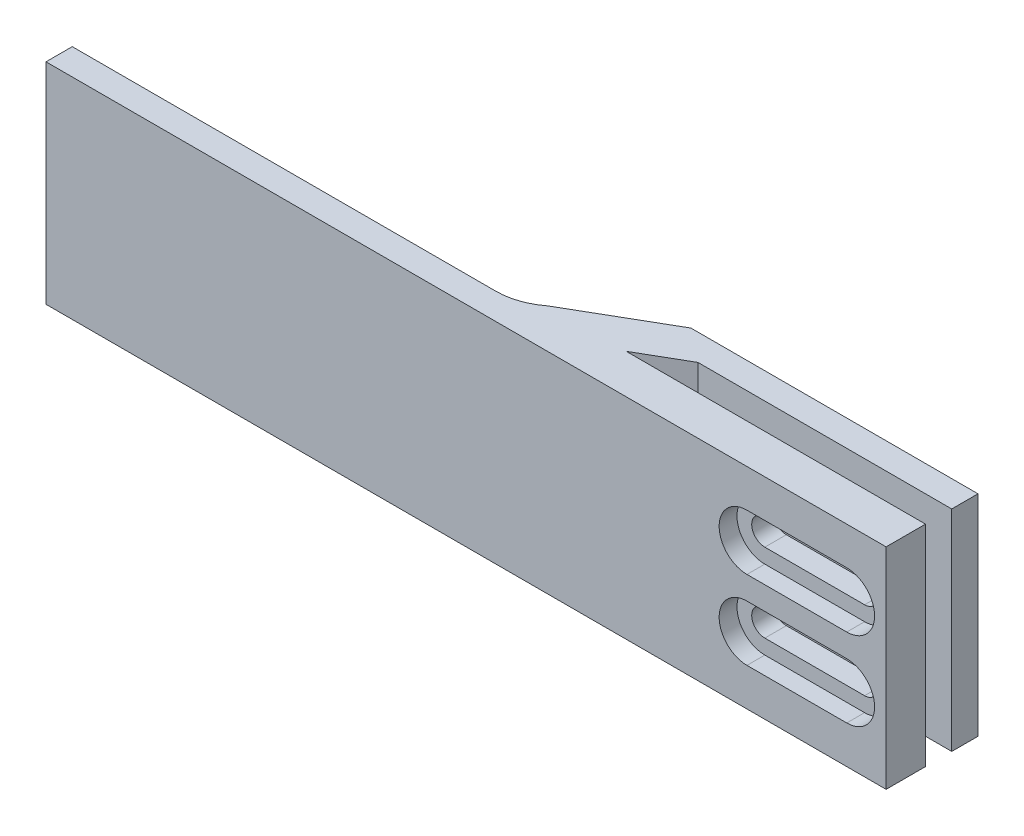
ISO-10303-21;
HEADER;
FILE_DESCRIPTION(('STEP AP214'),'2;1');
FILE_NAME('part.step','',(''),(''),'','','');
FILE_SCHEMA(('AUTOMOTIVE_DESIGN { 1 0 10303 214 1 1 1 1 }'));
ENDSEC;
DATA;
#1=APPLICATION_CONTEXT('core data for automotive mechanical design processes');
#2=APPLICATION_PROTOCOL_DEFINITION('international standard','automotive_design',2000,#1);
#3=PRODUCT_CONTEXT('',#1,'mechanical');
#4=PRODUCT('Part','Part','',(#3));
#5=PRODUCT_RELATED_PRODUCT_CATEGORY('part','',(#4));
#6=PRODUCT_DEFINITION_FORMATION('','',#4);
#7=PRODUCT_DEFINITION_CONTEXT('part definition',#1,'design');
#8=PRODUCT_DEFINITION('design','',#6,#7);
#9=PRODUCT_DEFINITION_SHAPE('','',#8);
#10=(LENGTH_UNIT() NAMED_UNIT(*) SI_UNIT(.MILLI.,.METRE.));
#11=(NAMED_UNIT(*) PLANE_ANGLE_UNIT() SI_UNIT($,.RADIAN.));
#12=(NAMED_UNIT(*) SI_UNIT($,.STERADIAN.) SOLID_ANGLE_UNIT());
#13=UNCERTAINTY_MEASURE_WITH_UNIT(LENGTH_MEASURE(1.E-05),#10,'distance_accuracy_value','');
#14=(GEOMETRIC_REPRESENTATION_CONTEXT(3) GLOBAL_UNCERTAINTY_ASSIGNED_CONTEXT((#13)) GLOBAL_UNIT_ASSIGNED_CONTEXT((#10,
#11,#12)) REPRESENTATION_CONTEXT('',''));
#15=CARTESIAN_POINT('',(0.,0.,0.));
#16=DIRECTION('',(0.,0.,1.));
#17=DIRECTION('',(1.,0.,0.));
#18=AXIS2_PLACEMENT_3D('',#15,#16,#17);
#19=CARTESIAN_POINT('',(0.,19.05,-15.5672163536067));
#20=DIRECTION('',(0.,1.,0.));
#21=DIRECTION('',(0.,0.,1.));
#22=AXIS2_PLACEMENT_3D('',#19,#20,#21);
#23=PLANE('',#22);
#24=DIRECTION('',(1.,0.,0.));
#25=VECTOR('',#24,1.);
#26=CARTESIAN_POINT('',(0.,19.05,8.95350000000002));
#27=LINE('',#26,#25);
#28=CARTESIAN_POINT('',(-16.8275,19.05,8.95350000000002));
#29=VERTEX_POINT('',#28);
#30=CARTESIAN_POINT('',(-4.7625,19.05,8.95350000000002));
#31=VERTEX_POINT('',#30);
#32=EDGE_CURVE('E301',#29,#31,#27,.T.);
#33=ORIENTED_EDGE('',*,*,#32,.F.);
#34=DIRECTION('',(0.,0.,1.));
#35=VECTOR('',#34,1.);
#36=CARTESIAN_POINT('',(-16.8275,19.05,-15.5672163536067));
#37=LINE('',#36,#35);
#38=CARTESIAN_POINT('',(-16.8275,19.05,6.35000000000001));
#39=VERTEX_POINT('',#38);
#40=EDGE_CURVE('E386',#39,#29,#37,.T.);
#41=ORIENTED_EDGE('',*,*,#40,.F.);
#42=DIRECTION('',(1.,0.,0.));
#43=VECTOR('',#42,1.);
#44=CARTESIAN_POINT('',(0.,19.05,6.35000000000002));
#45=LINE('',#44,#43);
#46=CARTESIAN_POINT('',(-4.7625,19.05,6.35000000000002));
#47=VERTEX_POINT('',#46);
#48=EDGE_CURVE('E498',#39,#47,#45,.T.);
#49=ORIENTED_EDGE('',*,*,#48,.T.);
#50=DIRECTION('',(0.,0.,1.));
#51=VECTOR('',#50,1.);
#52=CARTESIAN_POINT('',(-4.7625,19.05,-15.5672163536067));
#53=LINE('',#52,#51);
#54=EDGE_CURVE('E391',#47,#31,#53,.T.);
#55=ORIENTED_EDGE('',*,*,#54,.T.);
#56=EDGE_LOOP('',(#33,#41,#49,#55));
#57=FACE_BOUND('',#56,.T.);
#58=ADVANCED_FACE('F34',(#57),#23,.F.);
#59=CARTESIAN_POINT('',(-4.7625,17.4625,-15.5672163536067));
#60=DIRECTION('',(0.,0.,1.));
#61=DIRECTION('',(1.,0.,0.));
#62=AXIS2_PLACEMENT_3D('',#59,#60,#61);
#63=CYLINDRICAL_SURFACE('',#62,1.5875);
#64=CARTESIAN_POINT('',(-4.7625,17.4625,8.95350000000002));
#65=DIRECTION('',(0.,0.,1.));
#66=DIRECTION('',(1.,0.,0.));
#67=AXIS2_PLACEMENT_3D('',#64,#65,#66);
#68=CIRCLE('',#67,1.5875);
#69=CARTESIAN_POINT('',(-4.7625,15.875,8.95350000000002));
#70=VERTEX_POINT('',#69);
#71=EDGE_CURVE('E299',#31,#70,#68,.F.);
#72=ORIENTED_EDGE('',*,*,#71,.F.);
#73=ORIENTED_EDGE('',*,*,#54,.F.);
#74=CARTESIAN_POINT('',(-4.7625,17.4625,6.35000000000002));
#75=DIRECTION('',(0.,0.,-1.));
#76=DIRECTION('',(-1.,0.,0.));
#77=AXIS2_PLACEMENT_3D('',#74,#75,#76);
#78=CIRCLE('',#77,1.5875);
#79=CARTESIAN_POINT('',(-4.7625,15.875,6.35000000000002));
#80=VERTEX_POINT('',#79);
#81=EDGE_CURVE('E500',#47,#80,#78,.T.);
#82=ORIENTED_EDGE('',*,*,#81,.T.);
#83=DIRECTION('',(0.,0.,1.));
#84=VECTOR('',#83,1.);
#85=CARTESIAN_POINT('',(-4.7625,15.875,-15.5672163536067));
#86=LINE('',#85,#84);
#87=EDGE_CURVE('E397',#80,#70,#86,.T.);
#88=ORIENTED_EDGE('',*,*,#87,.T.);
#89=EDGE_LOOP('',(#72,#73,#82,#88));
#90=FACE_BOUND('',#89,.T.);
#91=ADVANCED_FACE('F557',(#90),#63,.F.);
#92=CARTESIAN_POINT('',(0.,15.875,-15.5672163536067));
#93=DIRECTION('',(0.,1.,0.));
#94=DIRECTION('',(0.,0.,1.));
#95=AXIS2_PLACEMENT_3D('',#92,#93,#94);
#96=PLANE('',#95);
#97=DIRECTION('',(0.,0.,1.));
#98=VECTOR('',#97,1.);
#99=CARTESIAN_POINT('',(-16.8275,15.875,-15.5672163536067));
#100=LINE('',#99,#98);
#101=CARTESIAN_POINT('',(-16.8275,15.875,6.35000000000002));
#102=VERTEX_POINT('',#101);
#103=CARTESIAN_POINT('',(-16.8275,15.875,8.95350000000002));
#104=VERTEX_POINT('',#103);
#105=EDGE_CURVE('E382',#102,#104,#100,.T.);
#106=ORIENTED_EDGE('',*,*,#105,.T.);
#107=DIRECTION('',(1.,0.,0.));
#108=VECTOR('',#107,1.);
#109=CARTESIAN_POINT('',(0.,15.875,8.95350000000002));
#110=LINE('',#109,#108);
#111=EDGE_CURVE('E56',#104,#70,#110,.T.);
#112=ORIENTED_EDGE('',*,*,#111,.T.);
#113=ORIENTED_EDGE('',*,*,#87,.F.);
#114=DIRECTION('',(1.,0.,0.));
#115=VECTOR('',#114,1.);
#116=CARTESIAN_POINT('',(0.,15.875,6.35000000000002));
#117=LINE('',#116,#115);
#118=EDGE_CURVE('E502',#102,#80,#117,.T.);
#119=ORIENTED_EDGE('',*,*,#118,.F.);
#120=EDGE_LOOP('',(#106,#112,#113,#119));
#121=FACE_BOUND('',#120,.T.);
#122=ADVANCED_FACE('F564',(#121),#96,.T.);
#123=CARTESIAN_POINT('',(-16.8275,17.4625,-15.5672163536067));
#124=DIRECTION('',(0.,0.,1.));
#125=DIRECTION('',(1.,0.,0.));
#126=AXIS2_PLACEMENT_3D('',#123,#124,#125);
#127=CYLINDRICAL_SURFACE('',#126,1.5875);
#128=CARTESIAN_POINT('',(-16.8275,17.4625,8.95350000000002));
#129=DIRECTION('',(0.,0.,1.));
#130=DIRECTION('',(1.,0.,0.));
#131=AXIS2_PLACEMENT_3D('',#128,#129,#130);
#132=CIRCLE('',#131,1.5875);
#133=EDGE_CURVE('E11',#104,#29,#132,.F.);
#134=ORIENTED_EDGE('',*,*,#133,.F.);
#135=ORIENTED_EDGE('',*,*,#105,.F.);
#136=CARTESIAN_POINT('',(-16.8275,17.4625,6.35000000000001));
#137=DIRECTION('',(0.,0.,-1.));
#138=DIRECTION('',(-1.,0.,0.));
#139=AXIS2_PLACEMENT_3D('',#136,#137,#138);
#140=CIRCLE('',#139,1.5875);
#141=EDGE_CURVE('E505',#102,#39,#140,.T.);
#142=ORIENTED_EDGE('',*,*,#141,.T.);
#143=ORIENTED_EDGE('',*,*,#40,.T.);
#144=EDGE_LOOP('',(#134,#135,#142,#143));
#145=FACE_BOUND('',#144,.T.);
#146=ADVANCED_FACE('F670',(#145),#127,.F.);
#147=CARTESIAN_POINT('',(-4.7625,7.9375,-15.5672163536067));
#148=DIRECTION('',(0.,0.,1.));
#149=DIRECTION('',(1.,0.,0.));
#150=AXIS2_PLACEMENT_3D('',#147,#148,#149);
#151=CYLINDRICAL_SURFACE('',#150,1.5875);
#152=DIRECTION('',(0.,0.,1.));
#153=VECTOR('',#152,1.);
#154=CARTESIAN_POINT('',(-4.7625,6.35,-15.5672163536067));
#155=LINE('',#154,#153);
#156=CARTESIAN_POINT('',(-4.7625,6.35,6.35000000000002));
#157=VERTEX_POINT('',#156);
#158=CARTESIAN_POINT('',(-4.7625,6.35,8.95350000000002));
#159=VERTEX_POINT('',#158);
#160=EDGE_CURVE('E348',#157,#159,#155,.T.);
#161=ORIENTED_EDGE('',*,*,#160,.T.);
#162=CARTESIAN_POINT('',(-4.7625,7.9375,8.95350000000002));
#163=DIRECTION('',(0.,0.,1.));
#164=DIRECTION('',(1.,0.,0.));
#165=AXIS2_PLACEMENT_3D('',#162,#163,#164);
#166=CIRCLE('',#165,1.5875);
#167=CARTESIAN_POINT('',(-4.7625,9.525,8.95350000000002));
#168=VERTEX_POINT('',#167);
#169=EDGE_CURVE('E341',#159,#168,#166,.T.);
#170=ORIENTED_EDGE('',*,*,#169,.T.);
#171=DIRECTION('',(0.,0.,1.));
#172=VECTOR('',#171,1.);
#173=CARTESIAN_POINT('',(-4.7625,9.525,-15.5672163536067));
#174=LINE('',#173,#172);
#175=CARTESIAN_POINT('',(-4.7625,9.525,6.35000000000002));
#176=VERTEX_POINT('',#175);
#177=EDGE_CURVE('E344',#176,#168,#174,.T.);
#178=ORIENTED_EDGE('',*,*,#177,.F.);
#179=CARTESIAN_POINT('',(-4.7625,7.9375,6.35000000000002));
#180=DIRECTION('',(0.,0.,-1.));
#181=DIRECTION('',(-1.,0.,0.));
#182=AXIS2_PLACEMENT_3D('',#179,#180,#181);
#183=CIRCLE('',#182,1.5875);
#184=EDGE_CURVE('E508',#157,#176,#183,.F.);
#185=ORIENTED_EDGE('',*,*,#184,.F.);
#186=EDGE_LOOP('',(#161,#170,#178,#185));
#187=FACE_BOUND('',#186,.T.);
#188=ADVANCED_FACE('F529',(#187),#151,.F.);
#189=CARTESIAN_POINT('',(-4.7625,6.35,-15.5672163536067));
#190=DIRECTION('',(0.,1.,0.));
#191=DIRECTION('',(0.,0.,1.));
#192=AXIS2_PLACEMENT_3D('',#189,#190,#191);
#193=PLANE('',#192);
#194=DIRECTION('',(0.,0.,1.));
#195=VECTOR('',#194,1.);
#196=CARTESIAN_POINT('',(-16.8275,6.35,-15.5672163536067));
#197=LINE('',#196,#195);
#198=CARTESIAN_POINT('',(-16.8275,6.35,6.35000000000002));
#199=VERTEX_POINT('',#198);
#200=CARTESIAN_POINT('',(-16.8275,6.35,8.95350000000002));
#201=VERTEX_POINT('',#200);
#202=EDGE_CURVE('E357',#199,#201,#197,.T.);
#203=ORIENTED_EDGE('',*,*,#202,.T.);
#204=DIRECTION('',(1.,0.,0.));
#205=VECTOR('',#204,1.);
#206=CARTESIAN_POINT('',(-4.7625,6.35,8.95350000000002));
#207=LINE('',#206,#205);
#208=EDGE_CURVE('E338',#201,#159,#207,.T.);
#209=ORIENTED_EDGE('',*,*,#208,.T.);
#210=ORIENTED_EDGE('',*,*,#160,.F.);
#211=DIRECTION('',(1.,0.,0.));
#212=VECTOR('',#211,1.);
#213=CARTESIAN_POINT('',(0.,6.35,6.35000000000002));
#214=LINE('',#213,#212);
#215=EDGE_CURVE('E511',#199,#157,#214,.T.);
#216=ORIENTED_EDGE('',*,*,#215,.F.);
#217=EDGE_LOOP('',(#203,#209,#210,#216));
#218=FACE_BOUND('',#217,.T.);
#219=ADVANCED_FACE('F538',(#218),#193,.T.);
#220=CARTESIAN_POINT('',(-16.8275,7.9375,-15.5672163536067));
#221=DIRECTION('',(0.,0.,1.));
#222=DIRECTION('',(1.,0.,0.));
#223=AXIS2_PLACEMENT_3D('',#220,#221,#222);
#224=CYLINDRICAL_SURFACE('',#223,1.5875);
#225=DIRECTION('',(0.,0.,1.));
#226=VECTOR('',#225,1.);
#227=CARTESIAN_POINT('',(-16.8275,9.525,-15.5672163536067));
#228=LINE('',#227,#226);
#229=CARTESIAN_POINT('',(-16.8275,9.525,6.35000000000001));
#230=VERTEX_POINT('',#229);
#231=CARTESIAN_POINT('',(-16.8275,9.525,8.95350000000002));
#232=VERTEX_POINT('',#231);
#233=EDGE_CURVE('E353',#230,#232,#228,.T.);
#234=ORIENTED_EDGE('',*,*,#233,.T.);
#235=CARTESIAN_POINT('',(-16.8275,7.9375,8.95350000000002));
#236=DIRECTION('',(0.,0.,1.));
#237=DIRECTION('',(1.,0.,0.));
#238=AXIS2_PLACEMENT_3D('',#235,#236,#237);
#239=CIRCLE('',#238,1.5875);
#240=EDGE_CURVE('E329',#232,#201,#239,.T.);
#241=ORIENTED_EDGE('',*,*,#240,.T.);
#242=ORIENTED_EDGE('',*,*,#202,.F.);
#243=CARTESIAN_POINT('',(-16.8275,7.9375,6.35000000000001));
#244=DIRECTION('',(0.,0.,-1.));
#245=DIRECTION('',(-1.,0.,0.));
#246=AXIS2_PLACEMENT_3D('',#243,#244,#245);
#247=CIRCLE('',#246,1.5875);
#248=EDGE_CURVE('E514',#230,#199,#247,.F.);
#249=ORIENTED_EDGE('',*,*,#248,.F.);
#250=EDGE_LOOP('',(#234,#241,#242,#249));
#251=FACE_BOUND('',#250,.T.);
#252=ADVANCED_FACE('F541',(#251),#224,.F.);
#253=CARTESIAN_POINT('',(-4.7625,9.525,-15.5672163536067));
#254=DIRECTION('',(0.,1.,0.));
#255=DIRECTION('',(0.,0.,1.));
#256=AXIS2_PLACEMENT_3D('',#253,#254,#255);
#257=PLANE('',#256);
#258=DIRECTION('',(1.,0.,0.));
#259=VECTOR('',#258,1.);
#260=CARTESIAN_POINT('',(-4.7625,9.525,8.95350000000002));
#261=LINE('',#260,#259);
#262=EDGE_CURVE('E42',#232,#168,#261,.T.);
#263=ORIENTED_EDGE('',*,*,#262,.F.);
#264=ORIENTED_EDGE('',*,*,#233,.F.);
#265=DIRECTION('',(1.,0.,0.));
#266=VECTOR('',#265,1.);
#267=CARTESIAN_POINT('',(0.,9.525,6.35000000000002));
#268=LINE('',#267,#266);
#269=EDGE_CURVE('E517',#230,#176,#268,.T.);
#270=ORIENTED_EDGE('',*,*,#269,.T.);
#271=ORIENTED_EDGE('',*,*,#177,.T.);
#272=EDGE_LOOP('',(#263,#264,#270,#271));
#273=FACE_BOUND('',#272,.T.);
#274=ADVANCED_FACE('F531',(#273),#257,.F.);
#275=CARTESIAN_POINT('',(-101.6,25.4,0.));
#276=DIRECTION('',(1.,0.,0.));
#277=DIRECTION('',(0.,0.,-1.));
#278=AXIS2_PLACEMENT_3D('',#275,#276,#277);
#279=PLANE('',#278);
#280=DIRECTION('',(0.,1.,0.));
#281=VECTOR('',#280,1.);
#282=CARTESIAN_POINT('',(-101.6,0.,7.93750000000001));
#283=LINE('',#282,#281);
#284=CARTESIAN_POINT('',(-101.6,0.,7.93750000000001));
#285=VERTEX_POINT('',#284);
#286=CARTESIAN_POINT('',(-101.6,25.4,7.93750000000001));
#287=VERTEX_POINT('',#286);
#288=EDGE_CURVE('E415',#285,#287,#283,.T.);
#289=ORIENTED_EDGE('',*,*,#288,.F.);
#290=DIRECTION('',(0.,0.,1.));
#291=VECTOR('',#290,1.);
#292=CARTESIAN_POINT('',(-101.6,0.,0.));
#293=LINE('',#292,#291);
#294=CARTESIAN_POINT('',(-101.6,0.,11.1125));
#295=VERTEX_POINT('',#294);
#296=EDGE_CURVE('E458',#285,#295,#293,.T.);
#297=ORIENTED_EDGE('',*,*,#296,.T.);
#298=DIRECTION('',(0.,-1.,0.));
#299=VECTOR('',#298,1.);
#300=CARTESIAN_POINT('',(-101.6,25.4,11.1125));
#301=LINE('',#300,#299);
#302=CARTESIAN_POINT('',(-101.6,25.4,11.1125));
#303=VERTEX_POINT('',#302);
#304=EDGE_CURVE('E478',#303,#295,#301,.T.);
#305=ORIENTED_EDGE('',*,*,#304,.F.);
#306=DIRECTION('',(0.,0.,1.));
#307=VECTOR('',#306,1.);
#308=CARTESIAN_POINT('',(-101.6,25.4,0.));
#309=LINE('',#308,#307);
#310=EDGE_CURVE('E434',#287,#303,#309,.T.);
#311=ORIENTED_EDGE('',*,*,#310,.F.);
#312=EDGE_LOOP('',(#289,#297,#305,#311));
#313=FACE_BOUND('',#312,.T.);
#314=ADVANCED_FACE('F549',(#313),#279,.F.);
#315=CARTESIAN_POINT('',(0.,25.4,3.175));
#316=DIRECTION('',(0.,0.,-1.));
#317=DIRECTION('',(-1.,0.,0.));
#318=AXIS2_PLACEMENT_3D('',#315,#316,#317);
#319=PLANE('',#318);
#320=CARTESIAN_POINT('',(-16.8275,7.9375,3.175));
#321=DIRECTION('',(0.,0.,-1.));
#322=DIRECTION('',(-1.,0.,0.));
#323=AXIS2_PLACEMENT_3D('',#320,#321,#322);
#324=CIRCLE('',#323,1.5875);
#325=CARTESIAN_POINT('',(-16.8275,9.525,3.175));
#326=VERTEX_POINT('',#325);
#327=CARTESIAN_POINT('',(-16.8275,6.35,3.175));
#328=VERTEX_POINT('',#327);
#329=EDGE_CURVE('E373',#326,#328,#324,.F.);
#330=ORIENTED_EDGE('',*,*,#329,.F.);
#331=DIRECTION('',(1.,0.,0.));
#332=VECTOR('',#331,1.);
#333=CARTESIAN_POINT('',(0.,9.525,3.175));
#334=LINE('',#333,#332);
#335=CARTESIAN_POINT('',(-4.7625,9.525,3.175));
#336=VERTEX_POINT('',#335);
#337=EDGE_CURVE('E375',#326,#336,#334,.T.);
#338=ORIENTED_EDGE('',*,*,#337,.T.);
#339=CARTESIAN_POINT('',(-4.7625,7.9375,3.175));
#340=DIRECTION('',(0.,0.,-1.));
#341=DIRECTION('',(-1.,0.,0.));
#342=AXIS2_PLACEMENT_3D('',#339,#340,#341);
#343=CIRCLE('',#342,1.5875);
#344=CARTESIAN_POINT('',(-4.7625,6.35,3.175));
#345=VERTEX_POINT('',#344);
#346=EDGE_CURVE('E366',#345,#336,#343,.F.);
#347=ORIENTED_EDGE('',*,*,#346,.F.);
#348=DIRECTION('',(1.,0.,0.));
#349=VECTOR('',#348,1.);
#350=CARTESIAN_POINT('',(0.,6.35,3.175));
#351=LINE('',#350,#349);
#352=EDGE_CURVE('E370',#328,#345,#351,.T.);
#353=ORIENTED_EDGE('',*,*,#352,.F.);
#354=EDGE_LOOP('',(#330,#338,#347,#353));
#355=FACE_BOUND('',#354,.T.);
#356=DIRECTION('',(1.,0.,0.));
#357=VECTOR('',#356,1.);
#358=CARTESIAN_POINT('',(0.,15.875,3.175));
#359=LINE('',#358,#357);
#360=CARTESIAN_POINT('',(-16.8275,15.875,3.175));
#361=VERTEX_POINT('',#360);
#362=CARTESIAN_POINT('',(-4.7625,15.875,3.175));
#363=VERTEX_POINT('',#362);
#364=EDGE_CURVE('E410',#361,#363,#359,.T.);
#365=ORIENTED_EDGE('',*,*,#364,.F.);
#366=CARTESIAN_POINT('',(-16.8275,17.4625,3.175));
#367=DIRECTION('',(0.,0.,-1.));
#368=DIRECTION('',(-1.,0.,0.));
#369=AXIS2_PLACEMENT_3D('',#366,#367,#368);
#370=CIRCLE('',#369,1.5875);
#371=CARTESIAN_POINT('',(-16.8275,19.05,3.175));
#372=VERTEX_POINT('',#371);
#373=EDGE_CURVE('E412',#361,#372,#370,.T.);
#374=ORIENTED_EDGE('',*,*,#373,.T.);
#375=DIRECTION('',(1.,0.,0.));
#376=VECTOR('',#375,1.);
#377=CARTESIAN_POINT('',(0.,19.05,3.175));
#378=LINE('',#377,#376);
#379=CARTESIAN_POINT('',(-4.7625,19.05,3.175));
#380=VERTEX_POINT('',#379);
#381=EDGE_CURVE('E404',#372,#380,#378,.T.);
#382=ORIENTED_EDGE('',*,*,#381,.T.);
#383=CARTESIAN_POINT('',(-4.7625,17.4625,3.175));
#384=DIRECTION('',(0.,0.,-1.));
#385=DIRECTION('',(-1.,0.,0.));
#386=AXIS2_PLACEMENT_3D('',#383,#384,#385);
#387=CIRCLE('',#386,1.5875);
#388=EDGE_CURVE('E407',#380,#363,#387,.T.);
#389=ORIENTED_EDGE('',*,*,#388,.T.);
#390=EDGE_LOOP('',(#365,#374,#382,#389));
#391=FACE_BOUND('',#390,.T.);
#392=DIRECTION('',(1.,0.,0.));
#393=VECTOR('',#392,1.);
#394=CARTESIAN_POINT('',(0.,0.,3.175));
#395=LINE('',#394,#393);
#396=CARTESIAN_POINT('',(-30.6957386859688,0.,3.175));
#397=VERTEX_POINT('',#396);
#398=CARTESIAN_POINT('',(0.,0.,3.175));
#399=VERTEX_POINT('',#398);
#400=EDGE_CURVE('E422',#397,#399,#395,.T.);
#401=ORIENTED_EDGE('',*,*,#400,.T.);
#402=DIRECTION('',(0.,-1.,0.));
#403=VECTOR('',#402,1.);
#404=CARTESIAN_POINT('',(0.,25.4,3.175));
#405=LINE('',#404,#403);
#406=CARTESIAN_POINT('',(0.,25.4,3.175));
#407=VERTEX_POINT('',#406);
#408=EDGE_CURVE('E488',#407,#399,#405,.T.);
#409=ORIENTED_EDGE('',*,*,#408,.F.);
#410=DIRECTION('',(1.,0.,0.));
#411=VECTOR('',#410,1.);
#412=CARTESIAN_POINT('',(0.,25.4,3.175));
#413=LINE('',#412,#411);
#414=CARTESIAN_POINT('',(-30.6957386859688,25.4,3.175));
#415=VERTEX_POINT('',#414);
#416=EDGE_CURVE('E423',#415,#407,#413,.T.);
#417=ORIENTED_EDGE('',*,*,#416,.F.);
#418=DIRECTION('',(0.,-1.,0.));
#419=VECTOR('',#418,1.);
#420=CARTESIAN_POINT('',(-30.6957386859688,25.4,3.175));
#421=LINE('',#420,#419);
#422=EDGE_CURVE('E446',#415,#397,#421,.T.);
#423=ORIENTED_EDGE('',*,*,#422,.T.);
#424=EDGE_LOOP('',(#401,#409,#417,#423));
#425=FACE_BOUND('',#424,.T.);
#426=ADVANCED_FACE('F593',(#355,#391,#425),#319,.F.);
#427=CARTESIAN_POINT('',(0.,25.4,0.));
#428=DIRECTION('',(-1.,0.,0.));
#429=DIRECTION('',(0.,0.,1.));
#430=AXIS2_PLACEMENT_3D('',#427,#428,#429);
#431=PLANE('',#430);
#432=DIRECTION('',(0.,0.,-1.));
#433=VECTOR('',#432,1.);
#434=CARTESIAN_POINT('',(0.,0.,0.));
#435=LINE('',#434,#433);
#436=CARTESIAN_POINT('',(0.,0.,0.));
#437=VERTEX_POINT('',#436);
#438=EDGE_CURVE('E449',#399,#437,#435,.T.);
#439=ORIENTED_EDGE('',*,*,#438,.T.);
#440=DIRECTION('',(0.,-1.,0.));
#441=VECTOR('',#440,1.);
#442=CARTESIAN_POINT('',(0.,25.4,0.));
#443=LINE('',#442,#441);
#444=CARTESIAN_POINT('',(0.,25.4,0.));
#445=VERTEX_POINT('',#444);
#446=EDGE_CURVE('E486',#445,#437,#443,.T.);
#447=ORIENTED_EDGE('',*,*,#446,.F.);
#448=DIRECTION('',(0.,0.,-1.));
#449=VECTOR('',#448,1.);
#450=CARTESIAN_POINT('',(0.,25.4,0.));
#451=LINE('',#450,#449);
#452=EDGE_CURVE('E426',#407,#445,#451,.T.);
#453=ORIENTED_EDGE('',*,*,#452,.F.);
#454=ORIENTED_EDGE('',*,*,#408,.T.);
#455=EDGE_LOOP('',(#439,#447,#453,#454));
#456=FACE_BOUND('',#455,.T.);
#457=ADVANCED_FACE('F596',(#456),#431,.F.);
#458=CARTESIAN_POINT('',(0.,25.4,0.));
#459=DIRECTION('',(0.,0.,-1.));
#460=DIRECTION('',(-1.,0.,0.));
#461=AXIS2_PLACEMENT_3D('',#458,#459,#460);
#462=PLANE('',#461);
#463=DIRECTION('',(-1.,0.,0.));
#464=VECTOR('',#463,1.);
#465=CARTESIAN_POINT('',(-4.7625,9.525,0.));
#466=LINE('',#465,#464);
#467=CARTESIAN_POINT('',(-4.7625,9.525,0.));
#468=VERTEX_POINT('',#467);
#469=CARTESIAN_POINT('',(-16.8275,9.525,0.));
#470=VERTEX_POINT('',#469);
#471=EDGE_CURVE('E352',#468,#470,#466,.T.);
#472=ORIENTED_EDGE('',*,*,#471,.T.);
#473=CARTESIAN_POINT('',(-16.8275,7.9375,0.));
#474=DIRECTION('',(0.,0.,-1.));
#475=DIRECTION('',(-1.,0.,0.));
#476=AXIS2_PLACEMENT_3D('',#473,#474,#475);
#477=CIRCLE('',#476,1.5875);
#478=CARTESIAN_POINT('',(-16.8275,6.35,0.));
#479=VERTEX_POINT('',#478);
#480=EDGE_CURVE('E360',#479,#470,#477,.T.);
#481=ORIENTED_EDGE('',*,*,#480,.F.);
#482=DIRECTION('',(-1.,0.,0.));
#483=VECTOR('',#482,1.);
#484=CARTESIAN_POINT('',(-4.7625,6.35,0.));
#485=LINE('',#484,#483);
#486=CARTESIAN_POINT('',(-4.7625,6.35,0.));
#487=VERTEX_POINT('',#486);
#488=EDGE_CURVE('E362',#487,#479,#485,.T.);
#489=ORIENTED_EDGE('',*,*,#488,.F.);
#490=CARTESIAN_POINT('',(-4.7625,7.9375,0.));
#491=DIRECTION('',(0.,0.,-1.));
#492=DIRECTION('',(-1.,0.,0.));
#493=AXIS2_PLACEMENT_3D('',#490,#491,#492);
#494=CIRCLE('',#493,1.5875);
#495=EDGE_CURVE('E364',#468,#487,#494,.T.);
#496=ORIENTED_EDGE('',*,*,#495,.F.);
#497=EDGE_LOOP('',(#472,#481,#489,#496));
#498=FACE_BOUND('',#497,.T.);
#499=CARTESIAN_POINT('',(-16.8275,17.4625,0.));
#500=DIRECTION('',(0.,0.,-1.));
#501=DIRECTION('',(-1.,0.,0.));
#502=AXIS2_PLACEMENT_3D('',#499,#500,#501);
#503=CIRCLE('',#502,1.5875);
#504=CARTESIAN_POINT('',(-16.8275,19.05,0.));
#505=VERTEX_POINT('',#504);
#506=CARTESIAN_POINT('',(-16.8275,15.875,0.));
#507=VERTEX_POINT('',#506);
#508=EDGE_CURVE('E379',#505,#507,#503,.F.);
#509=ORIENTED_EDGE('',*,*,#508,.T.);
#510=DIRECTION('',(-1.,0.,0.));
#511=VECTOR('',#510,1.);
#512=CARTESIAN_POINT('',(0.,15.875,0.));
#513=LINE('',#512,#511);
#514=CARTESIAN_POINT('',(-4.7625,15.875,0.));
#515=VERTEX_POINT('',#514);
#516=EDGE_CURVE('E378',#515,#507,#513,.T.);
#517=ORIENTED_EDGE('',*,*,#516,.F.);
#518=CARTESIAN_POINT('',(-4.7625,17.4625,0.));
#519=DIRECTION('',(0.,0.,-1.));
#520=DIRECTION('',(-1.,0.,0.));
#521=AXIS2_PLACEMENT_3D('',#518,#519,#520);
#522=CIRCLE('',#521,1.5875);
#523=CARTESIAN_POINT('',(-4.7625,19.05,0.));
#524=VERTEX_POINT('',#523);
#525=EDGE_CURVE('E388',#515,#524,#522,.F.);
#526=ORIENTED_EDGE('',*,*,#525,.T.);
#527=DIRECTION('',(-1.,0.,0.));
#528=VECTOR('',#527,1.);
#529=CARTESIAN_POINT('',(0.,19.05,0.));
#530=LINE('',#529,#528);
#531=EDGE_CURVE('E383',#524,#505,#530,.T.);
#532=ORIENTED_EDGE('',*,*,#531,.T.);
#533=EDGE_LOOP('',(#509,#517,#526,#532));
#534=FACE_BOUND('',#533,.T.);
#535=DIRECTION('',(1.,0.,0.));
#536=VECTOR('',#535,1.);
#537=CARTESIAN_POINT('',(0.,0.,0.));
#538=LINE('',#537,#536);
#539=CARTESIAN_POINT('',(-34.7214773719376,0.,0.));
#540=VERTEX_POINT('',#539);
#541=EDGE_CURVE('E452',#540,#437,#538,.T.);
#542=ORIENTED_EDGE('',*,*,#541,.F.);
#543=DIRECTION('',(0.,-1.,0.));
#544=VECTOR('',#543,1.);
#545=CARTESIAN_POINT('',(-34.7214773719376,25.4,0.));
#546=LINE('',#545,#544);
#547=CARTESIAN_POINT('',(-34.7214773719376,25.4,0.));
#548=VERTEX_POINT('',#547);
#549=EDGE_CURVE('E484',#548,#540,#546,.T.);
#550=ORIENTED_EDGE('',*,*,#549,.F.);
#551=DIRECTION('',(1.,0.,0.));
#552=VECTOR('',#551,1.);
#553=CARTESIAN_POINT('',(0.,25.4,0.));
#554=LINE('',#553,#552);
#555=EDGE_CURVE('E429',#548,#445,#554,.T.);
#556=ORIENTED_EDGE('',*,*,#555,.T.);
#557=ORIENTED_EDGE('',*,*,#446,.T.);
#558=EDGE_LOOP('',(#542,#550,#556,#557));
#559=FACE_BOUND('',#558,.T.);
#560=ADVANCED_FACE('F586',(#498,#534,#559),#462,.T.);
#561=CARTESIAN_POINT('',(-8.68036934298446,25.4,-15.0348407305123));
#562=DIRECTION('',(0.500000000000002,0.,0.866025403784438));
#563=DIRECTION('',(0.866025403784438,0.,-0.500000000000002));
#564=AXIS2_PLACEMENT_3D('',#561,#562,#563);
#565=PLANE('',#564);
#566=DIRECTION('',(-0.866025403784438,0.,0.500000000000002));
#567=VECTOR('',#566,1.);
#568=CARTESIAN_POINT('',(-8.68036934298446,0.,-15.0348407305123));
#569=LINE('',#568,#567);
#570=CARTESIAN_POINT('',(-45.72,0.,6.35000000000001));
#571=VERTEX_POINT('',#570);
#572=EDGE_CURVE('E455',#540,#571,#569,.T.);
#573=ORIENTED_EDGE('',*,*,#572,.T.);
#574=DIRECTION('',(0.,-1.,0.));
#575=VECTOR('',#574,1.);
#576=CARTESIAN_POINT('',(-45.72,25.4,6.35000000000001));
#577=LINE('',#576,#575);
#578=CARTESIAN_POINT('',(-45.72,25.4,6.35000000000001));
#579=VERTEX_POINT('',#578);
#580=EDGE_CURVE('E481',#579,#571,#577,.T.);
#581=ORIENTED_EDGE('',*,*,#580,.F.);
#582=DIRECTION('',(-0.866025403784438,0.,0.500000000000002));
#583=VECTOR('',#582,1.);
#584=CARTESIAN_POINT('',(-8.68036934298446,25.4,-15.0348407305123));
#585=LINE('',#584,#583);
#586=EDGE_CURVE('E432',#548,#579,#585,.T.);
#587=ORIENTED_EDGE('',*,*,#586,.F.);
#588=ORIENTED_EDGE('',*,*,#549,.T.);
#589=EDGE_LOOP('',(#573,#581,#587,#588));
#590=FACE_BOUND('',#589,.T.);
#591=ADVANCED_FACE('F642',(#590),#565,.F.);
#592=CARTESIAN_POINT('',(0.,25.4,11.1125));
#593=DIRECTION('',(0.,0.,-1.));
#594=DIRECTION('',(-1.,0.,0.));
#595=AXIS2_PLACEMENT_3D('',#592,#593,#594);
#596=PLANE('',#595);
#597=DIRECTION('',(-1.,0.,0.));
#598=VECTOR('',#597,1.);
#599=CARTESIAN_POINT('',(-4.7625,20.828,11.1125));
#600=LINE('',#599,#598);
#601=CARTESIAN_POINT('',(-4.7625,20.828,11.1125));
#602=VERTEX_POINT('',#601);
#603=CARTESIAN_POINT('',(-16.8275,20.828,11.1125));
#604=VERTEX_POINT('',#603);
#605=EDGE_CURVE('E289',#602,#604,#600,.T.);
#606=ORIENTED_EDGE('',*,*,#605,.F.);
#607=CARTESIAN_POINT('',(-4.7625,17.4625,11.1125));
#608=DIRECTION('',(0.,0.,1.));
#609=DIRECTION('',(1.,0.,0.));
#610=AXIS2_PLACEMENT_3D('',#607,#608,#609);
#611=CIRCLE('',#610,3.3655);
#612=CARTESIAN_POINT('',(-4.7625,14.097,11.1125));
#613=VERTEX_POINT('',#612);
#614=EDGE_CURVE('E49',#613,#602,#611,.T.);
#615=ORIENTED_EDGE('',*,*,#614,.F.);
#616=DIRECTION('',(1.,0.,0.));
#617=VECTOR('',#616,1.);
#618=CARTESIAN_POINT('',(-4.7625,14.097,11.1125));
#619=LINE('',#618,#617);
#620=CARTESIAN_POINT('',(-16.8275,14.097,11.1125));
#621=VERTEX_POINT('',#620);
#622=EDGE_CURVE('E280',#621,#613,#619,.T.);
#623=ORIENTED_EDGE('',*,*,#622,.F.);
#624=CARTESIAN_POINT('',(-16.8275,17.4625,11.1125));
#625=DIRECTION('',(0.,0.,1.));
#626=DIRECTION('',(1.,0.,0.));
#627=AXIS2_PLACEMENT_3D('',#624,#625,#626);
#628=CIRCLE('',#627,3.3655);
#629=EDGE_CURVE('E283',#604,#621,#628,.T.);
#630=ORIENTED_EDGE('',*,*,#629,.F.);
#631=EDGE_LOOP('',(#606,#615,#623,#630));
#632=FACE_BOUND('',#631,.T.);
#633=DIRECTION('',(-1.,0.,0.));
#634=VECTOR('',#633,1.);
#635=CARTESIAN_POINT('',(-4.7625,11.303,11.1125));
#636=LINE('',#635,#634);
#637=CARTESIAN_POINT('',(-4.7625,11.303,11.1125));
#638=VERTEX_POINT('',#637);
#639=CARTESIAN_POINT('',(-16.8275,11.303,11.1125));
#640=VERTEX_POINT('',#639);
#641=EDGE_CURVE('E319',#638,#640,#636,.T.);
#642=ORIENTED_EDGE('',*,*,#641,.F.);
#643=CARTESIAN_POINT('',(-4.7625,7.9375,11.1125));
#644=DIRECTION('',(0.,0.,1.));
#645=DIRECTION('',(1.,0.,0.));
#646=AXIS2_PLACEMENT_3D('',#643,#644,#645);
#647=CIRCLE('',#646,3.3655);
#648=CARTESIAN_POINT('',(-4.7625,4.572,11.1125));
#649=VERTEX_POINT('',#648);
#650=EDGE_CURVE('E303',#649,#638,#647,.T.);
#651=ORIENTED_EDGE('',*,*,#650,.F.);
#652=DIRECTION('',(1.,0.,0.));
#653=VECTOR('',#652,1.);
#654=CARTESIAN_POINT('',(-4.7625,4.572,11.1125));
#655=LINE('',#654,#653);
#656=CARTESIAN_POINT('',(-16.8275,4.572,11.1125));
#657=VERTEX_POINT('',#656);
#658=EDGE_CURVE('E308',#657,#649,#655,.T.);
#659=ORIENTED_EDGE('',*,*,#658,.F.);
#660=CARTESIAN_POINT('',(-16.8275,7.9375,11.1125));
#661=DIRECTION('',(0.,0.,1.));
#662=DIRECTION('',(1.,0.,0.));
#663=AXIS2_PLACEMENT_3D('',#660,#661,#662);
#664=CIRCLE('',#663,3.3655);
#665=EDGE_CURVE('E322',#640,#657,#664,.T.);
#666=ORIENTED_EDGE('',*,*,#665,.F.);
#667=EDGE_LOOP('',(#642,#651,#659,#666));
#668=FACE_BOUND('',#667,.T.);
#669=DIRECTION('',(1.,0.,0.));
#670=VECTOR('',#669,1.);
#671=CARTESIAN_POINT('',(0.,0.,11.1125));
#672=LINE('',#671,#670);
#673=CARTESIAN_POINT('',(0.,0.,11.1125));
#674=VERTEX_POINT('',#673);
#675=EDGE_CURVE('E460',#295,#674,#672,.T.);
#676=ORIENTED_EDGE('',*,*,#675,.T.);
#677=DIRECTION('',(0.,-1.,0.));
#678=VECTOR('',#677,1.);
#679=CARTESIAN_POINT('',(0.,25.4,11.1125));
#680=LINE('',#679,#678);
#681=CARTESIAN_POINT('',(0.,25.4,11.1125));
#682=VERTEX_POINT('',#681);
#683=EDGE_CURVE('E476',#682,#674,#680,.T.);
#684=ORIENTED_EDGE('',*,*,#683,.F.);
#685=DIRECTION('',(1.,0.,0.));
#686=VECTOR('',#685,1.);
#687=CARTESIAN_POINT('',(0.,25.4,11.1125));
#688=LINE('',#687,#686);
#689=EDGE_CURVE('E436',#303,#682,#688,.T.);
#690=ORIENTED_EDGE('',*,*,#689,.F.);
#691=ORIENTED_EDGE('',*,*,#304,.T.);
#692=EDGE_LOOP('',(#676,#684,#690,#691));
#693=FACE_BOUND('',#692,.T.);
#694=ADVANCED_FACE('F628',(#632,#668,#693),#596,.F.);
#695=CARTESIAN_POINT('',(0.,25.4,0.));
#696=DIRECTION('',(1.,0.,0.));
#697=DIRECTION('',(0.,0.,-1.));
#698=AXIS2_PLACEMENT_3D('',#695,#696,#697);
#699=PLANE('',#698);
#700=DIRECTION('',(0.,0.,1.));
#701=VECTOR('',#700,1.);
#702=CARTESIAN_POINT('',(0.,0.,0.));
#703=LINE('',#702,#701);
#704=CARTESIAN_POINT('',(0.,0.,6.35000000000002));
#705=VERTEX_POINT('',#704);
#706=EDGE_CURVE('E463',#705,#674,#703,.T.);
#707=ORIENTED_EDGE('',*,*,#706,.F.);
#708=DIRECTION('',(0.,-1.,0.));
#709=VECTOR('',#708,1.);
#710=CARTESIAN_POINT('',(0.,25.4,6.35000000000002));
#711=LINE('',#710,#709);
#712=CARTESIAN_POINT('',(0.,25.4,6.35000000000002));
#713=VERTEX_POINT('',#712);
#714=EDGE_CURVE('E474',#713,#705,#711,.T.);
#715=ORIENTED_EDGE('',*,*,#714,.F.);
#716=DIRECTION('',(0.,0.,1.));
#717=VECTOR('',#716,1.);
#718=CARTESIAN_POINT('',(0.,25.4,0.));
#719=LINE('',#718,#717);
#720=EDGE_CURVE('E438',#713,#682,#719,.T.);
#721=ORIENTED_EDGE('',*,*,#720,.T.);
#722=ORIENTED_EDGE('',*,*,#683,.T.);
#723=EDGE_LOOP('',(#707,#715,#721,#722));
#724=FACE_BOUND('',#723,.T.);
#725=ADVANCED_FACE('F624',(#724),#699,.T.);
#726=CARTESIAN_POINT('',(0.,25.4,6.35000000000002));
#727=DIRECTION('',(0.,0.,-1.));
#728=DIRECTION('',(-1.,0.,0.));
#729=AXIS2_PLACEMENT_3D('',#726,#727,#728);
#730=PLANE('',#729);
#731=ORIENTED_EDGE('',*,*,#269,.F.);
#732=ORIENTED_EDGE('',*,*,#248,.T.);
#733=ORIENTED_EDGE('',*,*,#215,.T.);
#734=ORIENTED_EDGE('',*,*,#184,.T.);
#735=EDGE_LOOP('',(#731,#732,#733,#734));
#736=FACE_BOUND('',#735,.T.);
#737=ORIENTED_EDGE('',*,*,#141,.F.);
#738=ORIENTED_EDGE('',*,*,#118,.T.);
#739=ORIENTED_EDGE('',*,*,#81,.F.);
#740=ORIENTED_EDGE('',*,*,#48,.F.);
#741=EDGE_LOOP('',(#737,#738,#739,#740));
#742=FACE_BOUND('',#741,.T.);
#743=DIRECTION('',(1.,0.,0.));
#744=VECTOR('',#743,1.);
#745=CARTESIAN_POINT('',(0.,0.,6.35000000000002));
#746=LINE('',#745,#744);
#747=CARTESIAN_POINT('',(-36.195,0.,6.35000000000001));
#748=VERTEX_POINT('',#747);
#749=EDGE_CURVE('E466',#748,#705,#746,.T.);
#750=ORIENTED_EDGE('',*,*,#749,.F.);
#751=DIRECTION('',(0.,-1.,0.));
#752=VECTOR('',#751,1.);
#753=CARTESIAN_POINT('',(-36.195,25.4,6.35000000000001));
#754=LINE('',#753,#752);
#755=CARTESIAN_POINT('',(-36.195,25.4,6.35000000000001));
#756=VERTEX_POINT('',#755);
#757=EDGE_CURVE('E472',#756,#748,#754,.T.);
#758=ORIENTED_EDGE('',*,*,#757,.F.);
#759=DIRECTION('',(1.,0.,0.));
#760=VECTOR('',#759,1.);
#761=CARTESIAN_POINT('',(0.,25.4,6.35000000000002));
#762=LINE('',#761,#760);
#763=EDGE_CURVE('E441',#756,#713,#762,.T.);
#764=ORIENTED_EDGE('',*,*,#763,.T.);
#765=ORIENTED_EDGE('',*,*,#714,.T.);
#766=EDGE_LOOP('',(#750,#758,#764,#765));
#767=FACE_BOUND('',#766,.T.);
#768=ADVANCED_FACE('F534',(#736,#742,#767),#730,.T.);
#769=CARTESIAN_POINT('',(-6.29911934298445,25.4,-10.9103947449889));
#770=DIRECTION('',(-0.500000000000001,0.,-0.866025403784438));
#771=DIRECTION('',(-0.866025403784438,0.,0.500000000000001));
#772=AXIS2_PLACEMENT_3D('',#769,#770,#771);
#773=PLANE('',#772);
#774=DIRECTION('',(0.866025403784438,0.,-0.500000000000001));
#775=VECTOR('',#774,1.);
#776=CARTESIAN_POINT('',(-6.29911934298445,0.,-10.9103947449889));
#777=LINE('',#776,#775);
#778=EDGE_CURVE('E427',#748,#397,#777,.T.);
#779=ORIENTED_EDGE('',*,*,#778,.T.);
#780=ORIENTED_EDGE('',*,*,#422,.F.);
#781=DIRECTION('',(0.866025403784438,0.,-0.500000000000001));
#782=VECTOR('',#781,1.);
#783=CARTESIAN_POINT('',(-6.29911934298445,25.4,-10.9103947449889));
#784=LINE('',#783,#782);
#785=EDGE_CURVE('E444',#756,#415,#784,.T.);
#786=ORIENTED_EDGE('',*,*,#785,.F.);
#787=ORIENTED_EDGE('',*,*,#757,.T.);
#788=EDGE_LOOP('',(#779,#780,#786,#787));
#789=FACE_BOUND('',#788,.T.);
#790=ADVANCED_FACE('F618',(#789),#773,.F.);
#791=CARTESIAN_POINT('',(0.,25.4,0.));
#792=DIRECTION('',(0.,1.,0.));
#793=DIRECTION('',(0.,0.,1.));
#794=AXIS2_PLACEMENT_3D('',#791,#792,#793);
#795=PLANE('',#794);
#796=ORIENTED_EDGE('',*,*,#586,.T.);
#797=CARTESIAN_POINT('',(-50.3754638598103,25.4,0.31750000000001));
#798=DIRECTION('',(0.,1.,0.));
#799=DIRECTION('',(0.,0.,1.));
#800=AXIS2_PLACEMENT_3D('',#797,#798,#799);
#801=CIRCLE('',#800,7.62);
#802=CARTESIAN_POINT('',(-50.3754638598103,25.4,7.93750000000001));
#803=VERTEX_POINT('',#802);
#804=EDGE_CURVE('E496',#579,#803,#801,.F.);
#805=ORIENTED_EDGE('',*,*,#804,.T.);
#806=DIRECTION('',(1.,0.,0.));
#807=VECTOR('',#806,1.);
#808=CARTESIAN_POINT('',(-101.6,25.4,7.93750000000001));
#809=LINE('',#808,#807);
#810=EDGE_CURVE('E417',#287,#803,#809,.T.);
#811=ORIENTED_EDGE('',*,*,#810,.F.);
#812=ORIENTED_EDGE('',*,*,#310,.T.);
#813=ORIENTED_EDGE('',*,*,#689,.T.);
#814=ORIENTED_EDGE('',*,*,#720,.F.);
#815=ORIENTED_EDGE('',*,*,#763,.F.);
#816=ORIENTED_EDGE('',*,*,#785,.T.);
#817=ORIENTED_EDGE('',*,*,#416,.T.);
#818=ORIENTED_EDGE('',*,*,#452,.T.);
#819=ORIENTED_EDGE('',*,*,#555,.F.);
#820=EDGE_LOOP('',(#796,#805,#811,#812,#813,#814,#815,#816,#817,#818,#819));
#821=FACE_BOUND('',#820,.T.);
#822=ADVANCED_FACE('F613',(#821),#795,.T.);
#823=CARTESIAN_POINT('',(0.,0.,0.));
#824=DIRECTION('',(0.,1.,0.));
#825=DIRECTION('',(0.,0.,1.));
#826=AXIS2_PLACEMENT_3D('',#823,#824,#825);
#827=PLANE('',#826);
#828=DIRECTION('',(-1.,0.,0.));
#829=VECTOR('',#828,1.);
#830=CARTESIAN_POINT('',(-101.6,0.,7.93750000000001));
#831=LINE('',#830,#829);
#832=CARTESIAN_POINT('',(-50.3754638598103,0.,7.93750000000001));
#833=VERTEX_POINT('',#832);
#834=EDGE_CURVE('E420',#833,#285,#831,.T.);
#835=ORIENTED_EDGE('',*,*,#834,.F.);
#836=CARTESIAN_POINT('',(-50.3754638598103,0.,0.31750000000001));
#837=DIRECTION('',(0.,1.,0.));
#838=DIRECTION('',(0.,0.,1.));
#839=AXIS2_PLACEMENT_3D('',#836,#837,#838);
#840=CIRCLE('',#839,7.62);
#841=EDGE_CURVE('E494',#833,#571,#840,.T.);
#842=ORIENTED_EDGE('',*,*,#841,.T.);
#843=ORIENTED_EDGE('',*,*,#572,.F.);
#844=ORIENTED_EDGE('',*,*,#541,.T.);
#845=ORIENTED_EDGE('',*,*,#438,.F.);
#846=ORIENTED_EDGE('',*,*,#400,.F.);
#847=ORIENTED_EDGE('',*,*,#778,.F.);
#848=ORIENTED_EDGE('',*,*,#749,.T.);
#849=ORIENTED_EDGE('',*,*,#706,.T.);
#850=ORIENTED_EDGE('',*,*,#675,.F.);
#851=ORIENTED_EDGE('',*,*,#296,.F.);
#852=EDGE_LOOP('',(#835,#842,#843,#844,#845,#846,#847,#848,#849,#850,#851));
#853=FACE_BOUND('',#852,.T.);
#854=ADVANCED_FACE('F605',(#853),#827,.F.);
#855=CARTESIAN_POINT('',(0.,0.,7.93750000000001));
#856=DIRECTION('',(0.,0.,-1.));
#857=DIRECTION('',(-1.,0.,0.));
#858=AXIS2_PLACEMENT_3D('',#855,#856,#857);
#859=PLANE('',#858);
#860=ORIENTED_EDGE('',*,*,#810,.T.);
#861=DIRECTION('',(0.,1.,0.));
#862=VECTOR('',#861,1.);
#863=CARTESIAN_POINT('',(-50.3754638598103,0.,7.93750000000001));
#864=LINE('',#863,#862);
#865=EDGE_CURVE('E491',#803,#833,#864,.F.);
#866=ORIENTED_EDGE('',*,*,#865,.T.);
#867=ORIENTED_EDGE('',*,*,#834,.T.);
#868=ORIENTED_EDGE('',*,*,#288,.T.);
#869=EDGE_LOOP('',(#860,#866,#867,#868));
#870=FACE_BOUND('',#869,.T.);
#871=ADVANCED_FACE('F634',(#870),#859,.T.);
#872=CARTESIAN_POINT('',(-50.3754638598103,0.,0.31750000000001));
#873=DIRECTION('',(0.,-1.,0.));
#874=DIRECTION('',(0.,0.,-1.));
#875=AXIS2_PLACEMENT_3D('',#872,#873,#874);
#876=CYLINDRICAL_SURFACE('',#875,7.62);
#877=ORIENTED_EDGE('',*,*,#804,.F.);
#878=ORIENTED_EDGE('',*,*,#580,.T.);
#879=ORIENTED_EDGE('',*,*,#841,.F.);
#880=ORIENTED_EDGE('',*,*,#865,.F.);
#881=EDGE_LOOP('',(#877,#878,#879,#880));
#882=FACE_BOUND('',#881,.T.);
#883=ADVANCED_FACE('F36',(#882),#876,.F.);
#884=EDGE_CURVE('E398',#507,#361,#100,.T.);
#885=ORIENTED_EDGE('',*,*,#884,.F.);
#886=ORIENTED_EDGE('',*,*,#508,.F.);
#887=EDGE_CURVE('E401',#505,#372,#37,.T.);
#888=ORIENTED_EDGE('',*,*,#887,.T.);
#889=ORIENTED_EDGE('',*,*,#373,.F.);
#890=EDGE_LOOP('',(#885,#886,#888,#889));
#891=FACE_BOUND('',#890,.T.);
#892=ADVANCED_FACE('F583',(#891),#127,.F.);
#893=ORIENTED_EDGE('',*,*,#364,.T.);
#894=EDGE_CURVE('E392',#515,#363,#86,.T.);
#895=ORIENTED_EDGE('',*,*,#894,.F.);
#896=ORIENTED_EDGE('',*,*,#516,.T.);
#897=ORIENTED_EDGE('',*,*,#884,.T.);
#898=EDGE_LOOP('',(#893,#895,#896,#897));
#899=FACE_BOUND('',#898,.T.);
#900=ADVANCED_FACE('F577',(#899),#96,.T.);
#901=EDGE_CURVE('E387',#524,#380,#53,.T.);
#902=ORIENTED_EDGE('',*,*,#901,.F.);
#903=ORIENTED_EDGE('',*,*,#525,.F.);
#904=ORIENTED_EDGE('',*,*,#894,.T.);
#905=ORIENTED_EDGE('',*,*,#388,.F.);
#906=EDGE_LOOP('',(#902,#903,#904,#905));
#907=FACE_BOUND('',#906,.T.);
#908=ADVANCED_FACE('F567',(#907),#63,.F.);
#909=ORIENTED_EDGE('',*,*,#887,.F.);
#910=ORIENTED_EDGE('',*,*,#531,.F.);
#911=ORIENTED_EDGE('',*,*,#901,.T.);
#912=ORIENTED_EDGE('',*,*,#381,.F.);
#913=EDGE_LOOP('',(#909,#910,#911,#912));
#914=FACE_BOUND('',#913,.T.);
#915=ADVANCED_FACE('F560',(#914),#23,.F.);
#916=EDGE_CURVE('E349',#470,#326,#228,.T.);
#917=ORIENTED_EDGE('',*,*,#916,.F.);
#918=ORIENTED_EDGE('',*,*,#471,.F.);
#919=EDGE_CURVE('E345',#468,#336,#174,.T.);
#920=ORIENTED_EDGE('',*,*,#919,.T.);
#921=ORIENTED_EDGE('',*,*,#337,.F.);
#922=EDGE_LOOP('',(#917,#918,#920,#921));
#923=FACE_BOUND('',#922,.T.);
#924=ADVANCED_FACE('F551',(#923),#257,.F.);
#925=ORIENTED_EDGE('',*,*,#329,.T.);
#926=EDGE_CURVE('E354',#479,#328,#197,.T.);
#927=ORIENTED_EDGE('',*,*,#926,.F.);
#928=ORIENTED_EDGE('',*,*,#480,.T.);
#929=ORIENTED_EDGE('',*,*,#916,.T.);
#930=EDGE_LOOP('',(#925,#927,#928,#929));
#931=FACE_BOUND('',#930,.T.);
#932=ADVANCED_FACE('F544',(#931),#224,.F.);
#933=ORIENTED_EDGE('',*,*,#352,.T.);
#934=EDGE_CURVE('E358',#487,#345,#155,.T.);
#935=ORIENTED_EDGE('',*,*,#934,.F.);
#936=ORIENTED_EDGE('',*,*,#488,.T.);
#937=ORIENTED_EDGE('',*,*,#926,.T.);
#938=EDGE_LOOP('',(#933,#935,#936,#937));
#939=FACE_BOUND('',#938,.T.);
#940=ADVANCED_FACE('F553',(#939),#193,.T.);
#941=ORIENTED_EDGE('',*,*,#346,.T.);
#942=ORIENTED_EDGE('',*,*,#919,.F.);
#943=ORIENTED_EDGE('',*,*,#495,.T.);
#944=ORIENTED_EDGE('',*,*,#934,.T.);
#945=EDGE_LOOP('',(#941,#942,#943,#944));
#946=FACE_BOUND('',#945,.T.);
#947=ADVANCED_FACE('F772',(#946),#151,.F.);
#948=CARTESIAN_POINT('',(-4.7625,7.9375,8.95350000000002));
#949=DIRECTION('',(0.,0.,1.));
#950=DIRECTION('',(1.,0.,0.));
#951=AXIS2_PLACEMENT_3D('',#948,#949,#950);
#952=CYLINDRICAL_SURFACE('',#951,3.3655);
#953=ORIENTED_EDGE('',*,*,#650,.T.);
#954=DIRECTION('',(0.,0.,1.));
#955=VECTOR('',#954,1.);
#956=CARTESIAN_POINT('',(-4.7625,11.303,8.95350000000002));
#957=LINE('',#956,#955);
#958=CARTESIAN_POINT('',(-4.7625,11.303,8.95350000000002));
#959=VERTEX_POINT('',#958);
#960=EDGE_CURVE('E317',#959,#638,#957,.T.);
#961=ORIENTED_EDGE('',*,*,#960,.F.);
#962=CARTESIAN_POINT('',(-4.7625,7.9375,8.95350000000002));
#963=DIRECTION('',(0.,0.,1.));
#964=DIRECTION('',(1.,0.,0.));
#965=AXIS2_PLACEMENT_3D('',#962,#963,#964);
#966=CIRCLE('',#965,3.3655);
#967=CARTESIAN_POINT('',(-4.7625,4.572,8.95350000000002));
#968=VERTEX_POINT('',#967);
#969=EDGE_CURVE('E304',#968,#959,#966,.T.);
#970=ORIENTED_EDGE('',*,*,#969,.F.);
#971=DIRECTION('',(0.,0.,1.));
#972=VECTOR('',#971,1.);
#973=CARTESIAN_POINT('',(-4.7625,4.572,8.95350000000002));
#974=LINE('',#973,#972);
#975=EDGE_CURVE('E327',#968,#649,#974,.T.);
#976=ORIENTED_EDGE('',*,*,#975,.T.);
#977=EDGE_LOOP('',(#953,#961,#970,#976));
#978=FACE_BOUND('',#977,.T.);
#979=ADVANCED_FACE('F800',(#978),#952,.F.);
#980=CARTESIAN_POINT('',(-4.7625,4.572,8.95350000000002));
#981=DIRECTION('',(0.,-1.,0.));
#982=DIRECTION('',(1.,0.,0.));
#983=AXIS2_PLACEMENT_3D('',#980,#981,#982);
#984=PLANE('',#983);
#985=ORIENTED_EDGE('',*,*,#658,.T.);
#986=ORIENTED_EDGE('',*,*,#975,.F.);
#987=DIRECTION('',(1.,0.,0.));
#988=VECTOR('',#987,1.);
#989=CARTESIAN_POINT('',(-4.7625,4.572,8.95350000000002));
#990=LINE('',#989,#988);
#991=CARTESIAN_POINT('',(-16.8275,4.572,8.95350000000002));
#992=VERTEX_POINT('',#991);
#993=EDGE_CURVE('E314',#992,#968,#990,.T.);
#994=ORIENTED_EDGE('',*,*,#993,.F.);
#995=DIRECTION('',(0.,0.,1.));
#996=VECTOR('',#995,1.);
#997=CARTESIAN_POINT('',(-16.8275,4.572,8.95350000000002));
#998=LINE('',#997,#996);
#999=EDGE_CURVE('E330',#992,#657,#998,.T.);
#1000=ORIENTED_EDGE('',*,*,#999,.T.);
#1001=EDGE_LOOP('',(#985,#986,#994,#1000));
#1002=FACE_BOUND('',#1001,.T.);
#1003=ADVANCED_FACE('F859',(#1002),#984,.F.);
#1004=CARTESIAN_POINT('',(-16.8275,7.9375,8.95350000000002));
#1005=DIRECTION('',(0.,0.,1.));
#1006=DIRECTION('',(1.,0.,0.));
#1007=AXIS2_PLACEMENT_3D('',#1004,#1005,#1006);
#1008=CYLINDRICAL_SURFACE('',#1007,3.3655);
#1009=ORIENTED_EDGE('',*,*,#665,.T.);
#1010=ORIENTED_EDGE('',*,*,#999,.F.);
#1011=CARTESIAN_POINT('',(-16.8275,7.9375,8.95350000000002));
#1012=DIRECTION('',(0.,0.,1.));
#1013=DIRECTION('',(1.,0.,0.));
#1014=AXIS2_PLACEMENT_3D('',#1011,#1012,#1013);
#1015=CIRCLE('',#1014,3.3655);
#1016=CARTESIAN_POINT('',(-16.8275,11.303,8.95350000000002));
#1017=VERTEX_POINT('',#1016);
#1018=EDGE_CURVE('E311',#1017,#992,#1015,.T.);
#1019=ORIENTED_EDGE('',*,*,#1018,.F.);
#1020=DIRECTION('',(0.,0.,1.));
#1021=VECTOR('',#1020,1.);
#1022=CARTESIAN_POINT('',(-16.8275,11.303,8.95350000000002));
#1023=LINE('',#1022,#1021);
#1024=EDGE_CURVE('E332',#1017,#640,#1023,.T.);
#1025=ORIENTED_EDGE('',*,*,#1024,.T.);
#1026=EDGE_LOOP('',(#1009,#1010,#1019,#1025));
#1027=FACE_BOUND('',#1026,.T.);
#1028=ADVANCED_FACE('F866',(#1027),#1008,.F.);
#1029=CARTESIAN_POINT('',(-4.7625,11.303,8.95350000000002));
#1030=DIRECTION('',(0.,1.,0.));
#1031=DIRECTION('',(-1.,0.,0.));
#1032=AXIS2_PLACEMENT_3D('',#1029,#1030,#1031);
#1033=PLANE('',#1032);
#1034=ORIENTED_EDGE('',*,*,#641,.T.);
#1035=ORIENTED_EDGE('',*,*,#1024,.F.);
#1036=DIRECTION('',(-1.,0.,0.));
#1037=VECTOR('',#1036,1.);
#1038=CARTESIAN_POINT('',(-4.7625,11.303,8.95350000000002));
#1039=LINE('',#1038,#1037);
#1040=EDGE_CURVE('E307',#959,#1017,#1039,.T.);
#1041=ORIENTED_EDGE('',*,*,#1040,.F.);
#1042=ORIENTED_EDGE('',*,*,#960,.T.);
#1043=EDGE_LOOP('',(#1034,#1035,#1041,#1042));
#1044=FACE_BOUND('',#1043,.T.);
#1045=ADVANCED_FACE('F874',(#1044),#1033,.F.);
#1046=CARTESIAN_POINT('',(-4.7625,7.9375,8.95350000000002));
#1047=DIRECTION('',(0.,0.,1.));
#1048=DIRECTION('',(1.,0.,0.));
#1049=AXIS2_PLACEMENT_3D('',#1046,#1047,#1048);
#1050=PLANE('',#1049);
#1051=ORIENTED_EDGE('',*,*,#208,.F.);
#1052=ORIENTED_EDGE('',*,*,#240,.F.);
#1053=ORIENTED_EDGE('',*,*,#262,.T.);
#1054=ORIENTED_EDGE('',*,*,#169,.F.);
#1055=EDGE_LOOP('',(#1051,#1052,#1053,#1054));
#1056=FACE_BOUND('',#1055,.T.);
#1057=ORIENTED_EDGE('',*,*,#969,.T.);
#1058=ORIENTED_EDGE('',*,*,#1040,.T.);
#1059=ORIENTED_EDGE('',*,*,#1018,.T.);
#1060=ORIENTED_EDGE('',*,*,#993,.T.);
#1061=EDGE_LOOP('',(#1057,#1058,#1059,#1060));
#1062=FACE_BOUND('',#1061,.T.);
#1063=ADVANCED_FACE('F521',(#1056,#1062),#1050,.T.);
#1064=CARTESIAN_POINT('',(-4.7625,17.4625,8.95350000000002));
#1065=DIRECTION('',(0.,0.,1.));
#1066=DIRECTION('',(1.,0.,0.));
#1067=AXIS2_PLACEMENT_3D('',#1064,#1065,#1066);
#1068=PLANE('',#1067);
#1069=CARTESIAN_POINT('',(-4.7625,17.4625,8.95350000000002));
#1070=DIRECTION('',(0.,0.,1.));
#1071=DIRECTION('',(1.,0.,0.));
#1072=AXIS2_PLACEMENT_3D('',#1069,#1070,#1071);
#1073=CIRCLE('',#1072,3.3655);
#1074=CARTESIAN_POINT('',(-4.7625,14.097,8.95350000000002));
#1075=VERTEX_POINT('',#1074);
#1076=CARTESIAN_POINT('',(-4.7625,20.828,8.95350000000002));
#1077=VERTEX_POINT('',#1076);
#1078=EDGE_CURVE('E262',#1075,#1077,#1073,.T.);
#1079=ORIENTED_EDGE('',*,*,#1078,.T.);
#1080=DIRECTION('',(-1.,0.,0.));
#1081=VECTOR('',#1080,1.);
#1082=CARTESIAN_POINT('',(-4.7625,20.828,8.95350000000002));
#1083=LINE('',#1082,#1081);
#1084=CARTESIAN_POINT('',(-16.8275,20.828,8.95350000000002));
#1085=VERTEX_POINT('',#1084);
#1086=EDGE_CURVE('E271',#1077,#1085,#1083,.T.);
#1087=ORIENTED_EDGE('',*,*,#1086,.T.);
#1088=CARTESIAN_POINT('',(-16.8275,17.4625,8.95350000000002));
#1089=DIRECTION('',(0.,0.,1.));
#1090=DIRECTION('',(1.,0.,0.));
#1091=AXIS2_PLACEMENT_3D('',#1088,#1089,#1090);
#1092=CIRCLE('',#1091,3.3655);
#1093=CARTESIAN_POINT('',(-16.8275,14.097,8.95350000000002));
#1094=VERTEX_POINT('',#1093);
#1095=EDGE_CURVE('E276',#1085,#1094,#1092,.T.);
#1096=ORIENTED_EDGE('',*,*,#1095,.T.);
#1097=DIRECTION('',(1.,0.,0.));
#1098=VECTOR('',#1097,1.);
#1099=CARTESIAN_POINT('',(-4.7625,14.097,8.95350000000002));
#1100=LINE('',#1099,#1098);
#1101=EDGE_CURVE('E268',#1094,#1075,#1100,.T.);
#1102=ORIENTED_EDGE('',*,*,#1101,.T.);
#1103=EDGE_LOOP('',(#1079,#1087,#1096,#1102));
#1104=FACE_BOUND('',#1103,.T.);
#1105=ORIENTED_EDGE('',*,*,#32,.T.);
#1106=ORIENTED_EDGE('',*,*,#71,.T.);
#1107=ORIENTED_EDGE('',*,*,#111,.F.);
#1108=ORIENTED_EDGE('',*,*,#133,.T.);
#1109=EDGE_LOOP('',(#1105,#1106,#1107,#1108));
#1110=FACE_BOUND('',#1109,.T.);
#1111=ADVANCED_FACE('F278',(#1104,#1110),#1068,.T.);
#1112=CARTESIAN_POINT('',(-4.7625,17.4625,8.95350000000002));
#1113=DIRECTION('',(0.,0.,1.));
#1114=DIRECTION('',(1.,0.,0.));
#1115=AXIS2_PLACEMENT_3D('',#1112,#1113,#1114);
#1116=CYLINDRICAL_SURFACE('',#1115,3.3655);
#1117=ORIENTED_EDGE('',*,*,#614,.T.);
#1118=DIRECTION('',(0.,0.,1.));
#1119=VECTOR('',#1118,1.);
#1120=CARTESIAN_POINT('',(-4.7625,20.828,8.95350000000002));
#1121=LINE('',#1120,#1119);
#1122=EDGE_CURVE('E258',#1077,#602,#1121,.T.);
#1123=ORIENTED_EDGE('',*,*,#1122,.F.);
#1124=ORIENTED_EDGE('',*,*,#1078,.F.);
#1125=DIRECTION('',(0.,0.,1.));
#1126=VECTOR('',#1125,1.);
#1127=CARTESIAN_POINT('',(-4.7625,14.097,8.95350000000002));
#1128=LINE('',#1127,#1126);
#1129=EDGE_CURVE('E293',#1075,#613,#1128,.T.);
#1130=ORIENTED_EDGE('',*,*,#1129,.T.);
#1131=EDGE_LOOP('',(#1117,#1123,#1124,#1130));
#1132=FACE_BOUND('',#1131,.T.);
#1133=ADVANCED_FACE('F260',(#1132),#1116,.F.);
#1134=CARTESIAN_POINT('',(-4.7625,14.097,8.95350000000002));
#1135=DIRECTION('',(0.,-1.,0.));
#1136=DIRECTION('',(1.,0.,0.));
#1137=AXIS2_PLACEMENT_3D('',#1134,#1135,#1136);
#1138=PLANE('',#1137);
#1139=ORIENTED_EDGE('',*,*,#622,.T.);
#1140=ORIENTED_EDGE('',*,*,#1129,.F.);
#1141=ORIENTED_EDGE('',*,*,#1101,.F.);
#1142=DIRECTION('',(0.,0.,1.));
#1143=VECTOR('',#1142,1.);
#1144=CARTESIAN_POINT('',(-16.8275,14.097,8.95350000000002));
#1145=LINE('',#1144,#1143);
#1146=EDGE_CURVE('E295',#1094,#621,#1145,.T.);
#1147=ORIENTED_EDGE('',*,*,#1146,.T.);
#1148=EDGE_LOOP('',(#1139,#1140,#1141,#1147));
#1149=FACE_BOUND('',#1148,.T.);
#1150=ADVANCED_FACE('F901',(#1149),#1138,.F.);
#1151=CARTESIAN_POINT('',(-16.8275,17.4625,8.95350000000002));
#1152=DIRECTION('',(0.,0.,1.));
#1153=DIRECTION('',(1.,0.,0.));
#1154=AXIS2_PLACEMENT_3D('',#1151,#1152,#1153);
#1155=CYLINDRICAL_SURFACE('',#1154,3.3655);
#1156=ORIENTED_EDGE('',*,*,#629,.T.);
#1157=ORIENTED_EDGE('',*,*,#1146,.F.);
#1158=ORIENTED_EDGE('',*,*,#1095,.F.);
#1159=DIRECTION('',(0.,0.,1.));
#1160=VECTOR('',#1159,1.);
#1161=CARTESIAN_POINT('',(-16.8275,20.828,8.95350000000002));
#1162=LINE('',#1161,#1160);
#1163=EDGE_CURVE('E267',#1085,#604,#1162,.T.);
#1164=ORIENTED_EDGE('',*,*,#1163,.T.);
#1165=EDGE_LOOP('',(#1156,#1157,#1158,#1164));
#1166=FACE_BOUND('',#1165,.T.);
#1167=ADVANCED_FACE('F908',(#1166),#1155,.F.);
#1168=CARTESIAN_POINT('',(-4.7625,20.828,8.95350000000002));
#1169=DIRECTION('',(0.,1.,0.));
#1170=DIRECTION('',(0.,0.,1.));
#1171=AXIS2_PLACEMENT_3D('',#1168,#1169,#1170);
#1172=PLANE('',#1171);
#1173=ORIENTED_EDGE('',*,*,#605,.T.);
#1174=ORIENTED_EDGE('',*,*,#1163,.F.);
#1175=ORIENTED_EDGE('',*,*,#1086,.F.);
#1176=ORIENTED_EDGE('',*,*,#1122,.T.);
#1177=EDGE_LOOP('',(#1173,#1174,#1175,#1176));
#1178=FACE_BOUND('',#1177,.T.);
#1179=ADVANCED_FACE('F272',(#1178),#1172,.F.);
#1180=CLOSED_SHELL('',(#58,#91,#122,#146,#188,#219,#252,#274,#314,#426,#457,#560,#591,#694,#725,
#768,#790,#822,#854,#871,#883,#892,#900,#908,#915,#924,#932,#940,#947,#979,#1003,#1028,#1045,
#1063,#1111,#1133,#1150,#1167,#1179));
#1181=MANIFOLD_SOLID_BREP('B2',#1180);
#1182=ADVANCED_BREP_SHAPE_REPRESENTATION('',(#18,#1181),#14);
#1183=SHAPE_DEFINITION_REPRESENTATION(#9,#1182);
ENDSEC;
END-ISO-10303-21;
